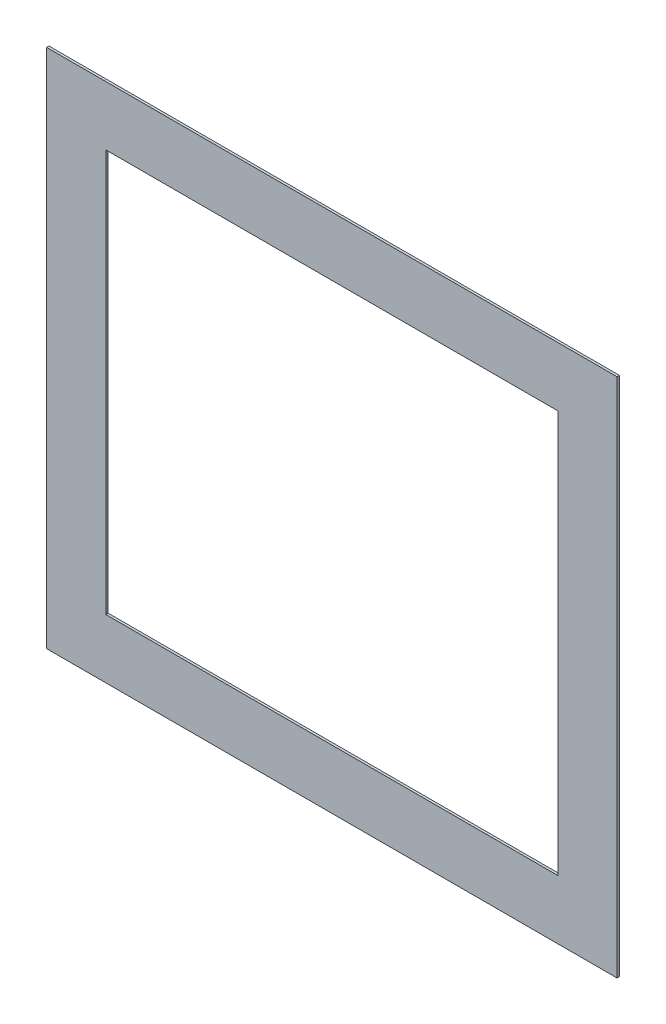
ISO-10303-21;
HEADER;
FILE_DESCRIPTION(('STEP AP214'),'2;1');
FILE_NAME('part.step','',(''),(''),'','','');
FILE_SCHEMA(('AUTOMOTIVE_DESIGN { 1 0 10303 214 1 1 1 1 }'));
ENDSEC;
DATA;
#1=APPLICATION_CONTEXT('core data for automotive mechanical design processes');
#2=APPLICATION_PROTOCOL_DEFINITION('international standard','automotive_design',2000,#1);
#3=PRODUCT_CONTEXT('',#1,'mechanical');
#4=PRODUCT('Part','Part','',(#3));
#5=PRODUCT_RELATED_PRODUCT_CATEGORY('part','',(#4));
#6=PRODUCT_DEFINITION_FORMATION('','',#4);
#7=PRODUCT_DEFINITION_CONTEXT('part definition',#1,'design');
#8=PRODUCT_DEFINITION('design','',#6,#7);
#9=PRODUCT_DEFINITION_SHAPE('','',#8);
#10=(LENGTH_UNIT() NAMED_UNIT(*) SI_UNIT(.MILLI.,.METRE.));
#11=(NAMED_UNIT(*) PLANE_ANGLE_UNIT() SI_UNIT($,.RADIAN.));
#12=(NAMED_UNIT(*) SI_UNIT($,.STERADIAN.) SOLID_ANGLE_UNIT());
#13=UNCERTAINTY_MEASURE_WITH_UNIT(LENGTH_MEASURE(1.E-05),#10,'distance_accuracy_value','');
#14=(GEOMETRIC_REPRESENTATION_CONTEXT(3) GLOBAL_UNCERTAINTY_ASSIGNED_CONTEXT((#13)) GLOBAL_UNIT_ASSIGNED_CONTEXT((#10,
#11,#12)) REPRESENTATION_CONTEXT('',''));
#15=CARTESIAN_POINT('',(0.,0.,0.));
#16=DIRECTION('',(0.,0.,1.));
#17=DIRECTION('',(1.,0.,0.));
#18=AXIS2_PLACEMENT_3D('',#15,#16,#17);
#19=CARTESIAN_POINT('',(0.,0.,0.2));
#20=DIRECTION('',(0.,0.,-1.));
#21=DIRECTION('',(-1.,0.,0.));
#22=AXIS2_PLACEMENT_3D('',#19,#20,#21);
#23=PLANE('',#22);
#24=DIRECTION('',(0.,-1.,0.));
#25=VECTOR('',#24,1.);
#26=CARTESIAN_POINT('',(0.,0.,0.2));
#27=LINE('',#26,#25);
#28=CARTESIAN_POINT('',(0.,44.,0.2));
#29=VERTEX_POINT('',#28);
#30=CARTESIAN_POINT('',(0.,0.,0.2));
#31=VERTEX_POINT('',#30);
#32=EDGE_CURVE('E153',#29,#31,#27,.T.);
#33=ORIENTED_EDGE('',*,*,#32,.T.);
#34=DIRECTION('',(1.,0.,0.));
#35=VECTOR('',#34,1.);
#36=CARTESIAN_POINT('',(0.,0.,0.2));
#37=LINE('',#36,#35);
#38=CARTESIAN_POINT('',(48.2,0.,0.2));
#39=VERTEX_POINT('',#38);
#40=EDGE_CURVE('E157',#31,#39,#37,.T.);
#41=ORIENTED_EDGE('',*,*,#40,.T.);
#42=DIRECTION('',(0.,1.,0.));
#43=VECTOR('',#42,1.);
#44=CARTESIAN_POINT('',(48.2,0.,0.2));
#45=LINE('',#44,#43);
#46=CARTESIAN_POINT('',(48.2,44.,0.2));
#47=VERTEX_POINT('',#46);
#48=EDGE_CURVE('E161',#39,#47,#45,.T.);
#49=ORIENTED_EDGE('',*,*,#48,.T.);
#50=DIRECTION('',(-1.,0.,0.));
#51=VECTOR('',#50,1.);
#52=CARTESIAN_POINT('',(0.,44.,0.2));
#53=LINE('',#52,#51);
#54=EDGE_CURVE('E164',#47,#29,#53,.T.);
#55=ORIENTED_EDGE('',*,*,#54,.T.);
#56=EDGE_LOOP('',(#33,#41,#49,#55));
#57=FACE_BOUND('',#56,.T.);
#58=DIRECTION('',(0.,-1.,0.));
#59=VECTOR('',#58,1.);
#60=CARTESIAN_POINT('',(5.,5.,0.2));
#61=LINE('',#60,#59);
#62=CARTESIAN_POINT('',(5.,39.,0.2));
#63=VERTEX_POINT('',#62);
#64=CARTESIAN_POINT('',(5.,5.,0.2));
#65=VERTEX_POINT('',#64);
#66=EDGE_CURVE('E105',#63,#65,#61,.T.);
#67=ORIENTED_EDGE('',*,*,#66,.F.);
#68=DIRECTION('',(-1.,0.,0.));
#69=VECTOR('',#68,1.);
#70=CARTESIAN_POINT('',(5.,39.,0.2));
#71=LINE('',#70,#69);
#72=CARTESIAN_POINT('',(43.2,39.,0.2));
#73=VERTEX_POINT('',#72);
#74=EDGE_CURVE('E131',#73,#63,#71,.T.);
#75=ORIENTED_EDGE('',*,*,#74,.F.);
#76=DIRECTION('',(0.,1.,0.));
#77=VECTOR('',#76,1.);
#78=CARTESIAN_POINT('',(43.2,5.,0.2));
#79=LINE('',#78,#77);
#80=CARTESIAN_POINT('',(43.2,5.,0.2));
#81=VERTEX_POINT('',#80);
#82=EDGE_CURVE('E127',#81,#73,#79,.T.);
#83=ORIENTED_EDGE('',*,*,#82,.F.);
#84=DIRECTION('',(1.,0.,0.));
#85=VECTOR('',#84,1.);
#86=CARTESIAN_POINT('',(5.,5.,0.2));
#87=LINE('',#86,#85);
#88=EDGE_CURVE('E114',#65,#81,#87,.T.);
#89=ORIENTED_EDGE('',*,*,#88,.F.);
#90=EDGE_LOOP('',(#67,#75,#83,#89));
#91=FACE_BOUND('',#90,.T.);
#92=ADVANCED_FACE('F39',(#57,#91),#23,.F.);
#93=CARTESIAN_POINT('',(0.,0.,0.));
#94=DIRECTION('',(0.,0.,-1.));
#95=DIRECTION('',(-1.,0.,0.));
#96=AXIS2_PLACEMENT_3D('',#93,#94,#95);
#97=PLANE('',#96);
#98=DIRECTION('',(0.,-1.,0.));
#99=VECTOR('',#98,1.);
#100=CARTESIAN_POINT('',(0.,0.,0.));
#101=LINE('',#100,#99);
#102=CARTESIAN_POINT('',(0.,44.,0.));
#103=VERTEX_POINT('',#102);
#104=CARTESIAN_POINT('',(0.,0.,0.));
#105=VERTEX_POINT('',#104);
#106=EDGE_CURVE('E123',#103,#105,#101,.T.);
#107=ORIENTED_EDGE('',*,*,#106,.F.);
#108=DIRECTION('',(-1.,0.,0.));
#109=VECTOR('',#108,1.);
#110=CARTESIAN_POINT('',(0.,44.,0.));
#111=LINE('',#110,#109);
#112=CARTESIAN_POINT('',(48.2,44.,0.));
#113=VERTEX_POINT('',#112);
#114=EDGE_CURVE('E158',#113,#103,#111,.T.);
#115=ORIENTED_EDGE('',*,*,#114,.F.);
#116=DIRECTION('',(0.,1.,0.));
#117=VECTOR('',#116,1.);
#118=CARTESIAN_POINT('',(48.2,0.,0.));
#119=LINE('',#118,#117);
#120=CARTESIAN_POINT('',(48.2,0.,0.));
#121=VERTEX_POINT('',#120);
#122=EDGE_CURVE('E174',#121,#113,#119,.T.);
#123=ORIENTED_EDGE('',*,*,#122,.F.);
#124=DIRECTION('',(1.,0.,0.));
#125=VECTOR('',#124,1.);
#126=CARTESIAN_POINT('',(0.,0.,0.));
#127=LINE('',#126,#125);
#128=EDGE_CURVE('E171',#105,#121,#127,.T.);
#129=ORIENTED_EDGE('',*,*,#128,.F.);
#130=EDGE_LOOP('',(#107,#115,#123,#129));
#131=FACE_BOUND('',#130,.T.);
#132=DIRECTION('',(-1.,0.,0.));
#133=VECTOR('',#132,1.);
#134=CARTESIAN_POINT('',(5.,39.,0.));
#135=LINE('',#134,#133);
#136=CARTESIAN_POINT('',(43.2,39.,0.));
#137=VERTEX_POINT('',#136);
#138=CARTESIAN_POINT('',(5.,39.,0.));
#139=VERTEX_POINT('',#138);
#140=EDGE_CURVE('E115',#137,#139,#135,.T.);
#141=ORIENTED_EDGE('',*,*,#140,.T.);
#142=DIRECTION('',(0.,-1.,0.));
#143=VECTOR('',#142,1.);
#144=CARTESIAN_POINT('',(5.,5.,0.));
#145=LINE('',#144,#143);
#146=CARTESIAN_POINT('',(5.,5.,0.));
#147=VERTEX_POINT('',#146);
#148=EDGE_CURVE('E63',#139,#147,#145,.T.);
#149=ORIENTED_EDGE('',*,*,#148,.T.);
#150=DIRECTION('',(1.,0.,0.));
#151=VECTOR('',#150,1.);
#152=CARTESIAN_POINT('',(5.,5.,0.));
#153=LINE('',#152,#151);
#154=CARTESIAN_POINT('',(43.2,5.,0.));
#155=VERTEX_POINT('',#154);
#156=EDGE_CURVE('E121',#147,#155,#153,.T.);
#157=ORIENTED_EDGE('',*,*,#156,.T.);
#158=DIRECTION('',(0.,1.,0.));
#159=VECTOR('',#158,1.);
#160=CARTESIAN_POINT('',(43.2,5.,0.));
#161=LINE('',#160,#159);
#162=EDGE_CURVE('E140',#155,#137,#161,.T.);
#163=ORIENTED_EDGE('',*,*,#162,.T.);
#164=EDGE_LOOP('',(#141,#149,#157,#163));
#165=FACE_BOUND('',#164,.T.);
#166=ADVANCED_FACE('F197',(#131,#165),#97,.T.);
#167=CARTESIAN_POINT('',(0.,0.,0.2));
#168=DIRECTION('',(1.,0.,0.));
#169=DIRECTION('',(0.,0.,-1.));
#170=AXIS2_PLACEMENT_3D('',#167,#168,#169);
#171=PLANE('',#170);
#172=ORIENTED_EDGE('',*,*,#106,.T.);
#173=DIRECTION('',(0.,0.,-1.));
#174=VECTOR('',#173,1.);
#175=CARTESIAN_POINT('',(0.,0.,0.2));
#176=LINE('',#175,#174);
#177=EDGE_CURVE('E11',#31,#105,#176,.T.);
#178=ORIENTED_EDGE('',*,*,#177,.F.);
#179=ORIENTED_EDGE('',*,*,#32,.F.);
#180=DIRECTION('',(0.,0.,-1.));
#181=VECTOR('',#180,1.);
#182=CARTESIAN_POINT('',(0.,44.,0.2));
#183=LINE('',#182,#181);
#184=EDGE_CURVE('E167',#29,#103,#183,.T.);
#185=ORIENTED_EDGE('',*,*,#184,.T.);
#186=EDGE_LOOP('',(#172,#178,#179,#185));
#187=FACE_BOUND('',#186,.T.);
#188=ADVANCED_FACE('F41',(#187),#171,.F.);
#189=CARTESIAN_POINT('',(0.,0.,0.2));
#190=DIRECTION('',(0.,1.,0.));
#191=DIRECTION('',(0.,0.,1.));
#192=AXIS2_PLACEMENT_3D('',#189,#190,#191);
#193=PLANE('',#192);
#194=ORIENTED_EDGE('',*,*,#128,.T.);
#195=DIRECTION('',(0.,0.,-1.));
#196=VECTOR('',#195,1.);
#197=CARTESIAN_POINT('',(48.2,0.,0.2));
#198=LINE('',#197,#196);
#199=EDGE_CURVE('E48',#39,#121,#198,.T.);
#200=ORIENTED_EDGE('',*,*,#199,.F.);
#201=ORIENTED_EDGE('',*,*,#40,.F.);
#202=ORIENTED_EDGE('',*,*,#177,.T.);
#203=EDGE_LOOP('',(#194,#200,#201,#202));
#204=FACE_BOUND('',#203,.T.);
#205=ADVANCED_FACE('F207',(#204),#193,.F.);
#206=CARTESIAN_POINT('',(48.2,0.,0.2));
#207=DIRECTION('',(-1.,0.,0.));
#208=DIRECTION('',(0.,0.,1.));
#209=AXIS2_PLACEMENT_3D('',#206,#207,#208);
#210=PLANE('',#209);
#211=ORIENTED_EDGE('',*,*,#122,.T.);
#212=DIRECTION('',(0.,0.,-1.));
#213=VECTOR('',#212,1.);
#214=CARTESIAN_POINT('',(48.2,44.,0.2));
#215=LINE('',#214,#213);
#216=EDGE_CURVE('E182',#47,#113,#215,.T.);
#217=ORIENTED_EDGE('',*,*,#216,.F.);
#218=ORIENTED_EDGE('',*,*,#48,.F.);
#219=ORIENTED_EDGE('',*,*,#199,.T.);
#220=EDGE_LOOP('',(#211,#217,#218,#219));
#221=FACE_BOUND('',#220,.T.);
#222=ADVANCED_FACE('F191',(#221),#210,.F.);
#223=CARTESIAN_POINT('',(0.,44.,0.2));
#224=DIRECTION('',(0.,-1.,0.));
#225=DIRECTION('',(0.,0.,-1.));
#226=AXIS2_PLACEMENT_3D('',#223,#224,#225);
#227=PLANE('',#226);
#228=ORIENTED_EDGE('',*,*,#114,.T.);
#229=ORIENTED_EDGE('',*,*,#184,.F.);
#230=ORIENTED_EDGE('',*,*,#54,.F.);
#231=ORIENTED_EDGE('',*,*,#216,.T.);
#232=EDGE_LOOP('',(#228,#229,#230,#231));
#233=FACE_BOUND('',#232,.T.);
#234=ADVANCED_FACE('F201',(#233),#227,.F.);
#235=CARTESIAN_POINT('',(5.,5.,0.2));
#236=DIRECTION('',(1.,0.,0.));
#237=DIRECTION('',(0.,0.,-1.));
#238=AXIS2_PLACEMENT_3D('',#235,#236,#237);
#239=PLANE('',#238);
#240=ORIENTED_EDGE('',*,*,#148,.F.);
#241=DIRECTION('',(0.,0.,-1.));
#242=VECTOR('',#241,1.);
#243=CARTESIAN_POINT('',(5.,39.,0.2));
#244=LINE('',#243,#242);
#245=EDGE_CURVE('E109',#63,#139,#244,.T.);
#246=ORIENTED_EDGE('',*,*,#245,.F.);
#247=ORIENTED_EDGE('',*,*,#66,.T.);
#248=DIRECTION('',(0.,0.,-1.));
#249=VECTOR('',#248,1.);
#250=CARTESIAN_POINT('',(5.,5.,0.2));
#251=LINE('',#250,#249);
#252=EDGE_CURVE('E108',#65,#147,#251,.T.);
#253=ORIENTED_EDGE('',*,*,#252,.T.);
#254=EDGE_LOOP('',(#240,#246,#247,#253));
#255=FACE_BOUND('',#254,.T.);
#256=ADVANCED_FACE('F107',(#255),#239,.T.);
#257=CARTESIAN_POINT('',(5.,5.,0.2));
#258=DIRECTION('',(0.,1.,0.));
#259=DIRECTION('',(0.,0.,1.));
#260=AXIS2_PLACEMENT_3D('',#257,#258,#259);
#261=PLANE('',#260);
#262=ORIENTED_EDGE('',*,*,#156,.F.);
#263=ORIENTED_EDGE('',*,*,#252,.F.);
#264=ORIENTED_EDGE('',*,*,#88,.T.);
#265=DIRECTION('',(0.,0.,-1.));
#266=VECTOR('',#265,1.);
#267=CARTESIAN_POINT('',(43.2,5.,0.2));
#268=LINE('',#267,#266);
#269=EDGE_CURVE('E124',#81,#155,#268,.T.);
#270=ORIENTED_EDGE('',*,*,#269,.T.);
#271=EDGE_LOOP('',(#262,#263,#264,#270));
#272=FACE_BOUND('',#271,.T.);
#273=ADVANCED_FACE('F118',(#272),#261,.T.);
#274=CARTESIAN_POINT('',(43.2,5.,0.2));
#275=DIRECTION('',(-1.,0.,0.));
#276=DIRECTION('',(0.,0.,1.));
#277=AXIS2_PLACEMENT_3D('',#274,#275,#276);
#278=PLANE('',#277);
#279=ORIENTED_EDGE('',*,*,#162,.F.);
#280=ORIENTED_EDGE('',*,*,#269,.F.);
#281=ORIENTED_EDGE('',*,*,#82,.T.);
#282=DIRECTION('',(0.,0.,-1.));
#283=VECTOR('',#282,1.);
#284=CARTESIAN_POINT('',(43.2,39.,0.2));
#285=LINE('',#284,#283);
#286=EDGE_CURVE('E55',#73,#137,#285,.T.);
#287=ORIENTED_EDGE('',*,*,#286,.T.);
#288=EDGE_LOOP('',(#279,#280,#281,#287));
#289=FACE_BOUND('',#288,.T.);
#290=ADVANCED_FACE('F230',(#289),#278,.T.);
#291=CARTESIAN_POINT('',(5.,39.,0.2));
#292=DIRECTION('',(0.,-1.,0.));
#293=DIRECTION('',(0.,0.,-1.));
#294=AXIS2_PLACEMENT_3D('',#291,#292,#293);
#295=PLANE('',#294);
#296=ORIENTED_EDGE('',*,*,#140,.F.);
#297=ORIENTED_EDGE('',*,*,#286,.F.);
#298=ORIENTED_EDGE('',*,*,#74,.T.);
#299=ORIENTED_EDGE('',*,*,#245,.T.);
#300=EDGE_LOOP('',(#296,#297,#298,#299));
#301=FACE_BOUND('',#300,.T.);
#302=ADVANCED_FACE('F234',(#301),#295,.T.);
#303=CLOSED_SHELL('',(#92,#166,#188,#205,#222,#234,#256,#273,#290,#302));
#304=MANIFOLD_SOLID_BREP('B2',#303);
#305=ADVANCED_BREP_SHAPE_REPRESENTATION('',(#18,#304),#14);
#306=SHAPE_DEFINITION_REPRESENTATION(#9,#305);
ENDSEC;
END-ISO-10303-21;
